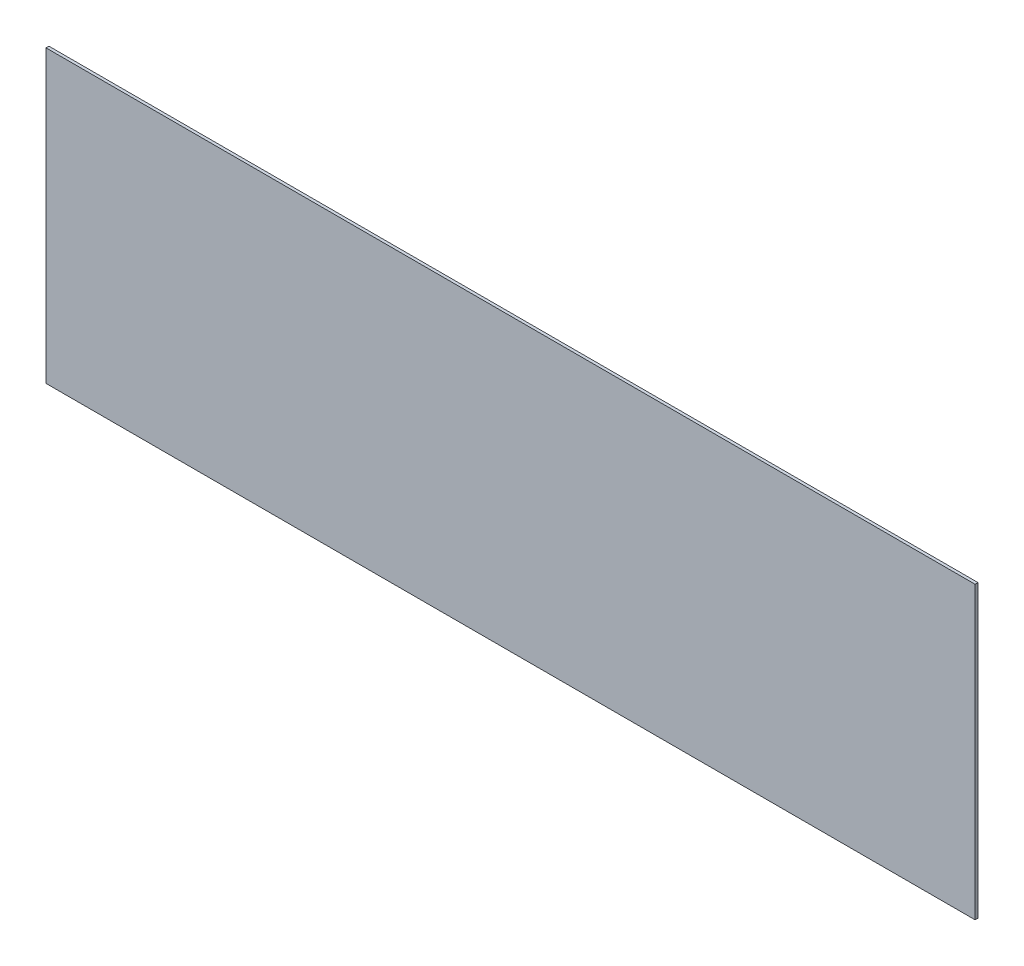
ISO-10303-21;
HEADER;
FILE_DESCRIPTION(('STEP AP214'),'2;1');
FILE_NAME('part.step','',(''),(''),'','','');
FILE_SCHEMA(('AUTOMOTIVE_DESIGN { 1 0 10303 214 1 1 1 1 }'));
ENDSEC;
DATA;
#1=APPLICATION_CONTEXT('core data for automotive mechanical design processes');
#2=APPLICATION_PROTOCOL_DEFINITION('international standard','automotive_design',2000,#1);
#3=PRODUCT_CONTEXT('',#1,'mechanical');
#4=PRODUCT('Part','Part','',(#3));
#5=PRODUCT_RELATED_PRODUCT_CATEGORY('part','',(#4));
#6=PRODUCT_DEFINITION_FORMATION('','',#4);
#7=PRODUCT_DEFINITION_CONTEXT('part definition',#1,'design');
#8=PRODUCT_DEFINITION('design','',#6,#7);
#9=PRODUCT_DEFINITION_SHAPE('','',#8);
#10=(LENGTH_UNIT() NAMED_UNIT(*) SI_UNIT(.MILLI.,.METRE.));
#11=(NAMED_UNIT(*) PLANE_ANGLE_UNIT() SI_UNIT($,.RADIAN.));
#12=(NAMED_UNIT(*) SI_UNIT($,.STERADIAN.) SOLID_ANGLE_UNIT());
#13=UNCERTAINTY_MEASURE_WITH_UNIT(LENGTH_MEASURE(1.E-05),#10,'distance_accuracy_value','');
#14=(GEOMETRIC_REPRESENTATION_CONTEXT(3) GLOBAL_UNCERTAINTY_ASSIGNED_CONTEXT((#13)) GLOBAL_UNIT_ASSIGNED_CONTEXT((#10,
#11,#12)) REPRESENTATION_CONTEXT('',''));
#15=CARTESIAN_POINT('',(0.,0.,0.));
#16=DIRECTION('',(0.,0.,1.));
#17=DIRECTION('',(1.,0.,0.));
#18=AXIS2_PLACEMENT_3D('',#15,#16,#17);
#19=CARTESIAN_POINT('',(0.,0.,0.));
#20=DIRECTION('',(0.,0.,1.));
#21=DIRECTION('',(1.,0.,0.));
#22=AXIS2_PLACEMENT_3D('',#19,#20,#21);
#23=PLANE('',#22);
#24=DIRECTION('',(1.,0.,0.));
#25=VECTOR('',#24,1.);
#26=CARTESIAN_POINT('',(-20.3,6.35,0.));
#27=LINE('',#26,#25);
#28=CARTESIAN_POINT('',(-20.3,6.35,0.));
#29=VERTEX_POINT('',#28);
#30=CARTESIAN_POINT('',(20.3,6.35,0.));
#31=VERTEX_POINT('',#30);
#32=EDGE_CURVE('E57',#29,#31,#27,.T.);
#33=ORIENTED_EDGE('',*,*,#32,.T.);
#34=DIRECTION('',(0.,1.,0.));
#35=VECTOR('',#34,1.);
#36=CARTESIAN_POINT('',(20.3,6.35,0.));
#37=LINE('',#36,#35);
#38=CARTESIAN_POINT('',(20.3,-6.35,0.));
#39=VERTEX_POINT('',#38);
#40=EDGE_CURVE('E20',#31,#39,#37,.F.);
#41=ORIENTED_EDGE('',*,*,#40,.T.);
#42=DIRECTION('',(1.,0.,0.));
#43=VECTOR('',#42,1.);
#44=CARTESIAN_POINT('',(-20.3,-6.35,0.));
#45=LINE('',#44,#43);
#46=CARTESIAN_POINT('',(-20.3,-6.35,0.));
#47=VERTEX_POINT('',#46);
#48=EDGE_CURVE('E80',#39,#47,#45,.F.);
#49=ORIENTED_EDGE('',*,*,#48,.T.);
#50=DIRECTION('',(0.,1.,0.));
#51=VECTOR('',#50,1.);
#52=CARTESIAN_POINT('',(-20.3,6.35,0.));
#53=LINE('',#52,#51);
#54=EDGE_CURVE('E55',#47,#29,#53,.T.);
#55=ORIENTED_EDGE('',*,*,#54,.T.);
#56=EDGE_LOOP('',(#33,#41,#49,#55));
#57=FACE_BOUND('',#56,.T.);
#58=ADVANCED_FACE('F17',(#57),#23,.F.);
#59=CARTESIAN_POINT('',(20.3,6.35,0.127));
#60=DIRECTION('',(-1.,0.,0.));
#61=DIRECTION('',(0.,0.,1.));
#62=AXIS2_PLACEMENT_3D('',#59,#60,#61);
#63=PLANE('',#62);
#64=DIRECTION('',(0.,0.,1.));
#65=VECTOR('',#64,1.);
#66=CARTESIAN_POINT('',(20.3,-6.35,0.127));
#67=LINE('',#66,#65);
#68=CARTESIAN_POINT('',(20.3,-6.35,0.127));
#69=VERTEX_POINT('',#68);
#70=EDGE_CURVE('E68',#69,#39,#67,.F.);
#71=ORIENTED_EDGE('',*,*,#70,.T.);
#72=ORIENTED_EDGE('',*,*,#40,.F.);
#73=DIRECTION('',(0.,0.,-1.));
#74=VECTOR('',#73,1.);
#75=CARTESIAN_POINT('',(20.3,6.35,0.127));
#76=LINE('',#75,#74);
#77=CARTESIAN_POINT('',(20.3,6.35,0.127));
#78=VERTEX_POINT('',#77);
#79=EDGE_CURVE('E63',#31,#78,#76,.F.);
#80=ORIENTED_EDGE('',*,*,#79,.T.);
#81=DIRECTION('',(0.,1.,0.));
#82=VECTOR('',#81,1.);
#83=CARTESIAN_POINT('',(20.3,0.,0.127));
#84=LINE('',#83,#82);
#85=EDGE_CURVE('E83',#69,#78,#84,.T.);
#86=ORIENTED_EDGE('',*,*,#85,.F.);
#87=EDGE_LOOP('',(#71,#72,#80,#86));
#88=FACE_BOUND('',#87,.T.);
#89=ADVANCED_FACE('F65',(#88),#63,.F.);
#90=CARTESIAN_POINT('',(-20.3,6.35,0.127));
#91=DIRECTION('',(0.,-1.,0.));
#92=DIRECTION('',(0.,0.,-1.));
#93=AXIS2_PLACEMENT_3D('',#90,#91,#92);
#94=PLANE('',#93);
#95=ORIENTED_EDGE('',*,*,#79,.F.);
#96=ORIENTED_EDGE('',*,*,#32,.F.);
#97=DIRECTION('',(0.,0.,1.));
#98=VECTOR('',#97,1.);
#99=CARTESIAN_POINT('',(-20.3,6.35,0.127));
#100=LINE('',#99,#98);
#101=CARTESIAN_POINT('',(-20.3,6.35,0.127));
#102=VERTEX_POINT('',#101);
#103=EDGE_CURVE('E75',#29,#102,#100,.T.);
#104=ORIENTED_EDGE('',*,*,#103,.T.);
#105=DIRECTION('',(1.,0.,0.));
#106=VECTOR('',#105,1.);
#107=CARTESIAN_POINT('',(0.,6.35,0.127));
#108=LINE('',#107,#106);
#109=EDGE_CURVE('E72',#78,#102,#108,.F.);
#110=ORIENTED_EDGE('',*,*,#109,.F.);
#111=EDGE_LOOP('',(#95,#96,#104,#110));
#112=FACE_BOUND('',#111,.T.);
#113=ADVANCED_FACE('F70',(#112),#94,.F.);
#114=CARTESIAN_POINT('',(-20.3,6.35,0.127));
#115=DIRECTION('',(1.,0.,0.));
#116=DIRECTION('',(0.,1.,0.));
#117=AXIS2_PLACEMENT_3D('',#114,#115,#116);
#118=PLANE('',#117);
#119=ORIENTED_EDGE('',*,*,#103,.F.);
#120=ORIENTED_EDGE('',*,*,#54,.F.);
#121=DIRECTION('',(0.,0.,1.));
#122=VECTOR('',#121,1.);
#123=CARTESIAN_POINT('',(-20.3,-6.35,0.127));
#124=LINE('',#123,#122);
#125=CARTESIAN_POINT('',(-20.3,-6.35,0.127));
#126=VERTEX_POINT('',#125);
#127=EDGE_CURVE('E35',#47,#126,#124,.T.);
#128=ORIENTED_EDGE('',*,*,#127,.T.);
#129=DIRECTION('',(0.,1.,0.));
#130=VECTOR('',#129,1.);
#131=CARTESIAN_POINT('',(-20.3,0.,0.127));
#132=LINE('',#131,#130);
#133=EDGE_CURVE('E26',#102,#126,#132,.F.);
#134=ORIENTED_EDGE('',*,*,#133,.F.);
#135=EDGE_LOOP('',(#119,#120,#128,#134));
#136=FACE_BOUND('',#135,.T.);
#137=ADVANCED_FACE('F89',(#136),#118,.F.);
#138=CARTESIAN_POINT('',(-20.3,-6.35,0.127));
#139=DIRECTION('',(0.,1.,0.));
#140=DIRECTION('',(0.,0.,1.));
#141=AXIS2_PLACEMENT_3D('',#138,#139,#140);
#142=PLANE('',#141);
#143=ORIENTED_EDGE('',*,*,#127,.F.);
#144=ORIENTED_EDGE('',*,*,#48,.F.);
#145=ORIENTED_EDGE('',*,*,#70,.F.);
#146=DIRECTION('',(1.,0.,0.));
#147=VECTOR('',#146,1.);
#148=CARTESIAN_POINT('',(0.,-6.35,0.127));
#149=LINE('',#148,#147);
#150=EDGE_CURVE('E11',#126,#69,#149,.T.);
#151=ORIENTED_EDGE('',*,*,#150,.F.);
#152=EDGE_LOOP('',(#143,#144,#145,#151));
#153=FACE_BOUND('',#152,.T.);
#154=ADVANCED_FACE('F91',(#153),#142,.F.);
#155=CARTESIAN_POINT('',(0.,0.,0.127));
#156=DIRECTION('',(0.,0.,1.));
#157=DIRECTION('',(1.,0.,0.));
#158=AXIS2_PLACEMENT_3D('',#155,#156,#157);
#159=PLANE('',#158);
#160=ORIENTED_EDGE('',*,*,#133,.T.);
#161=ORIENTED_EDGE('',*,*,#150,.T.);
#162=ORIENTED_EDGE('',*,*,#85,.T.);
#163=ORIENTED_EDGE('',*,*,#109,.T.);
#164=EDGE_LOOP('',(#160,#161,#162,#163));
#165=FACE_BOUND('',#164,.T.);
#166=ADVANCED_FACE('F88',(#165),#159,.T.);
#167=CLOSED_SHELL('',(#58,#89,#113,#137,#154,#166));
#168=MANIFOLD_SOLID_BREP('B1',#167);
#169=ADVANCED_BREP_SHAPE_REPRESENTATION('',(#18,#168),#14);
#170=SHAPE_DEFINITION_REPRESENTATION(#9,#169);
ENDSEC;
END-ISO-10303-21;
